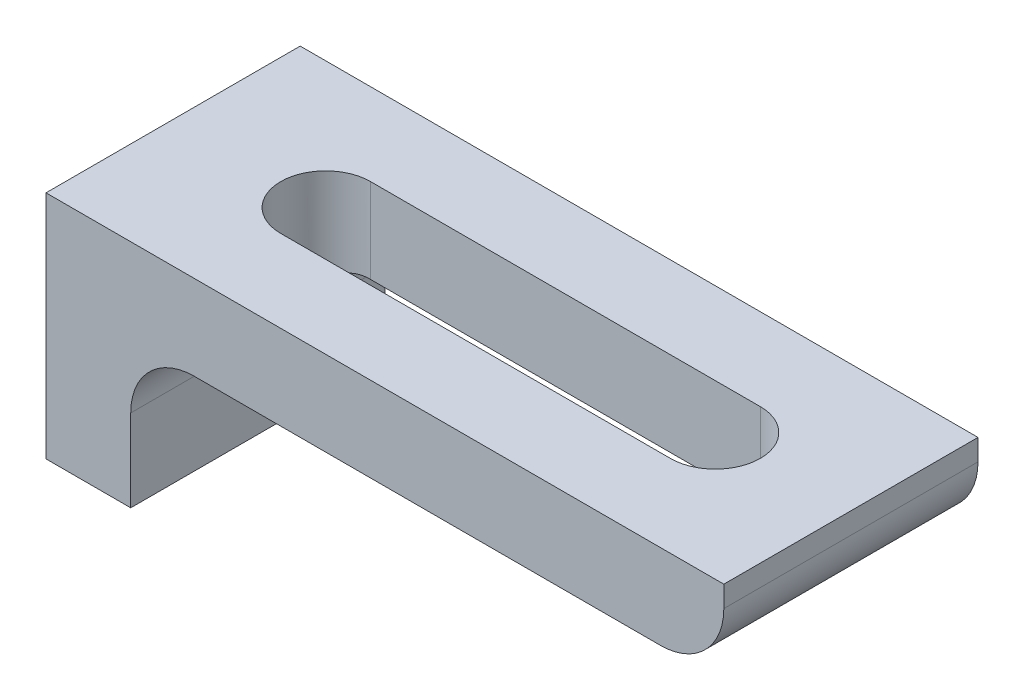
ISO-10303-21;
HEADER;
FILE_DESCRIPTION(('STEP AP214'),'2;1');
FILE_NAME('part.step','',(''),(''),'','','');
FILE_SCHEMA(('AUTOMOTIVE_DESIGN { 1 0 10303 214 1 1 1 1 }'));
ENDSEC;
DATA;
#1=APPLICATION_CONTEXT('core data for automotive mechanical design processes');
#2=APPLICATION_PROTOCOL_DEFINITION('international standard','automotive_design',2000,#1);
#3=PRODUCT_CONTEXT('',#1,'mechanical');
#4=PRODUCT('Part','Part','',(#3));
#5=PRODUCT_RELATED_PRODUCT_CATEGORY('part','',(#4));
#6=PRODUCT_DEFINITION_FORMATION('','',#4);
#7=PRODUCT_DEFINITION_CONTEXT('part definition',#1,'design');
#8=PRODUCT_DEFINITION('design','',#6,#7);
#9=PRODUCT_DEFINITION_SHAPE('','',#8);
#10=(LENGTH_UNIT() NAMED_UNIT(*) SI_UNIT(.MILLI.,.METRE.));
#11=(NAMED_UNIT(*) PLANE_ANGLE_UNIT() SI_UNIT($,.RADIAN.));
#12=(NAMED_UNIT(*) SI_UNIT($,.STERADIAN.) SOLID_ANGLE_UNIT());
#13=UNCERTAINTY_MEASURE_WITH_UNIT(LENGTH_MEASURE(1.E-05),#10,'distance_accuracy_value','');
#14=(GEOMETRIC_REPRESENTATION_CONTEXT(3) GLOBAL_UNCERTAINTY_ASSIGNED_CONTEXT((#13)) GLOBAL_UNIT_ASSIGNED_CONTEXT((#10,
#11,#12)) REPRESENTATION_CONTEXT('',''));
#15=CARTESIAN_POINT('',(0.,0.,0.));
#16=DIRECTION('',(0.,0.,1.));
#17=DIRECTION('',(1.,0.,0.));
#18=AXIS2_PLACEMENT_3D('',#15,#16,#17);
#19=CARTESIAN_POINT('',(-24.0344596091499,6.82331190254084,10.0359364843179));
#20=DIRECTION('',(0.,-1.,0.));
#21=DIRECTION('',(0.,0.,-1.));
#22=AXIS2_PLACEMENT_3D('',#19,#20,#21);
#23=PLANE('',#22);
#24=DIRECTION('',(-1.,0.,0.));
#25=VECTOR('',#24,1.);
#26=CARTESIAN_POINT('',(-12.6044596091499,6.82331190254084,-2.85456351568212));
#27=LINE('',#26,#25);
#28=CARTESIAN_POINT('',(16.6055403908501,6.82331190254084,-2.85456351568212));
#29=VERTEX_POINT('',#28);
#30=CARTESIAN_POINT('',(-12.6044596091499,6.82331190254084,-2.85456351568212));
#31=VERTEX_POINT('',#30);
#32=EDGE_CURVE('E123',#29,#31,#27,.T.);
#33=ORIENTED_EDGE('',*,*,#32,.F.);
#34=CARTESIAN_POINT('',(16.6055403908501,6.82331190254084,0.510936484317881));
#35=DIRECTION('',(0.,1.,0.));
#36=DIRECTION('',(0.,0.,1.));
#37=AXIS2_PLACEMENT_3D('',#34,#35,#36);
#38=CIRCLE('',#37,3.3655);
#39=CARTESIAN_POINT('',(16.6055403908501,6.82331190254084,3.87643648431788));
#40=VERTEX_POINT('',#39);
#41=EDGE_CURVE('E32',#40,#29,#38,.T.);
#42=ORIENTED_EDGE('',*,*,#41,.F.);
#43=DIRECTION('',(1.,0.,0.));
#44=VECTOR('',#43,1.);
#45=CARTESIAN_POINT('',(-12.6044596091499,6.82331190254084,3.87643648431788));
#46=LINE('',#45,#44);
#47=CARTESIAN_POINT('',(-12.6044596091499,6.82331190254084,3.87643648431788));
#48=VERTEX_POINT('',#47);
#49=EDGE_CURVE('E129',#48,#40,#46,.T.);
#50=ORIENTED_EDGE('',*,*,#49,.F.);
#51=CARTESIAN_POINT('',(-12.6044596091499,6.82331190254084,0.510936484317881));
#52=DIRECTION('',(0.,1.,0.));
#53=DIRECTION('',(0.,0.,1.));
#54=AXIS2_PLACEMENT_3D('',#51,#52,#53);
#55=CIRCLE('',#54,3.3655);
#56=EDGE_CURVE('E115',#31,#48,#55,.T.);
#57=ORIENTED_EDGE('',*,*,#56,.F.);
#58=EDGE_LOOP('',(#33,#42,#50,#57));
#59=FACE_BOUND('',#58,.T.);
#60=DIRECTION('',(-1.,0.,0.));
#61=VECTOR('',#60,1.);
#62=CARTESIAN_POINT('',(-24.0344596091499,6.82331190254084,-9.01406351568212));
#63=LINE('',#62,#61);
#64=CARTESIAN_POINT('',(26.7655403908501,6.82331190254084,-9.01406351568212));
#65=VERTEX_POINT('',#64);
#66=CARTESIAN_POINT('',(-24.0344596091499,6.82331190254084,-9.01406351568212));
#67=VERTEX_POINT('',#66);
#68=EDGE_CURVE('E147',#65,#67,#63,.T.);
#69=ORIENTED_EDGE('',*,*,#68,.T.);
#70=DIRECTION('',(0.,0.,-1.));
#71=VECTOR('',#70,1.);
#72=CARTESIAN_POINT('',(-24.0344596091499,6.82331190254084,10.0359364843179));
#73=LINE('',#72,#71);
#74=CARTESIAN_POINT('',(-24.0344596091499,6.82331190254084,10.0359364843179));
#75=VERTEX_POINT('',#74);
#76=EDGE_CURVE('E254',#75,#67,#73,.T.);
#77=ORIENTED_EDGE('',*,*,#76,.F.);
#78=DIRECTION('',(-1.,0.,0.));
#79=VECTOR('',#78,1.);
#80=CARTESIAN_POINT('',(-24.0344596091499,6.82331190254084,10.0359364843179));
#81=LINE('',#80,#79);
#82=CARTESIAN_POINT('',(26.7655403908501,6.82331190254084,10.0359364843179));
#83=VERTEX_POINT('',#82);
#84=EDGE_CURVE('E148',#83,#75,#81,.T.);
#85=ORIENTED_EDGE('',*,*,#84,.F.);
#86=DIRECTION('',(0.,0.,-1.));
#87=VECTOR('',#86,1.);
#88=CARTESIAN_POINT('',(26.7655403908501,6.82331190254084,10.0359364843179));
#89=LINE('',#88,#87);
#90=EDGE_CURVE('E238',#83,#65,#89,.T.);
#91=ORIENTED_EDGE('',*,*,#90,.T.);
#92=EDGE_LOOP('',(#69,#77,#85,#91));
#93=FACE_BOUND('',#92,.T.);
#94=ADVANCED_FACE('F16',(#59,#93),#23,.F.);
#95=CARTESIAN_POINT('',(-24.0344596091499,6.82331190254084,10.0359364843179));
#96=DIRECTION('',(1.,0.,0.));
#97=DIRECTION('',(0.,1.,0.));
#98=AXIS2_PLACEMENT_3D('',#95,#96,#97);
#99=PLANE('',#98);
#100=DIRECTION('',(0.,-1.,0.));
#101=VECTOR('',#100,1.);
#102=CARTESIAN_POINT('',(-24.0344596091499,6.82331190254084,-9.01406351568212));
#103=LINE('',#102,#101);
#104=CARTESIAN_POINT('',(-24.0344596091499,-10.4486880974592,-9.01406351568212));
#105=VERTEX_POINT('',#104);
#106=EDGE_CURVE('E277',#67,#105,#103,.T.);
#107=ORIENTED_EDGE('',*,*,#106,.T.);
#108=DIRECTION('',(0.,0.,-1.));
#109=VECTOR('',#108,1.);
#110=CARTESIAN_POINT('',(-24.0344596091499,-10.4486880974592,10.0359364843179));
#111=LINE('',#110,#109);
#112=CARTESIAN_POINT('',(-24.0344596091499,-10.4486880974592,10.0359364843179));
#113=VERTEX_POINT('',#112);
#114=EDGE_CURVE('E251',#113,#105,#111,.T.);
#115=ORIENTED_EDGE('',*,*,#114,.F.);
#116=DIRECTION('',(0.,-1.,0.));
#117=VECTOR('',#116,1.);
#118=CARTESIAN_POINT('',(-24.0344596091499,6.82331190254084,10.0359364843179));
#119=LINE('',#118,#117);
#120=EDGE_CURVE('E282',#75,#113,#119,.T.);
#121=ORIENTED_EDGE('',*,*,#120,.F.);
#122=ORIENTED_EDGE('',*,*,#76,.T.);
#123=EDGE_LOOP('',(#107,#115,#121,#122));
#124=FACE_BOUND('',#123,.T.);
#125=ADVANCED_FACE('F190',(#124),#99,.F.);
#126=CARTESIAN_POINT('',(-24.0344596091499,-10.4486880974592,10.0359364843179));
#127=DIRECTION('',(0.,1.,0.));
#128=DIRECTION('',(-1.,0.,0.));
#129=AXIS2_PLACEMENT_3D('',#126,#127,#128);
#130=PLANE('',#129);
#131=DIRECTION('',(1.,0.,0.));
#132=VECTOR('',#131,1.);
#133=CARTESIAN_POINT('',(-24.0344596091499,-10.4486880974592,-9.01406351568212));
#134=LINE('',#133,#132);
#135=CARTESIAN_POINT('',(-17.6844596091499,-10.4486880974592,-9.01406351568212));
#136=VERTEX_POINT('',#135);
#137=EDGE_CURVE('E218',#105,#136,#134,.T.);
#138=ORIENTED_EDGE('',*,*,#137,.T.);
#139=DIRECTION('',(0.,0.,-1.));
#140=VECTOR('',#139,1.);
#141=CARTESIAN_POINT('',(-17.6844596091499,-10.4486880974592,10.0359364843179));
#142=LINE('',#141,#140);
#143=CARTESIAN_POINT('',(-17.6844596091499,-10.4486880974592,10.0359364843179));
#144=VERTEX_POINT('',#143);
#145=EDGE_CURVE('E214',#144,#136,#142,.T.);
#146=ORIENTED_EDGE('',*,*,#145,.F.);
#147=DIRECTION('',(1.,0.,0.));
#148=VECTOR('',#147,1.);
#149=CARTESIAN_POINT('',(-24.0344596091499,-10.4486880974592,10.0359364843179));
#150=LINE('',#149,#148);
#151=EDGE_CURVE('E288',#113,#144,#150,.T.);
#152=ORIENTED_EDGE('',*,*,#151,.F.);
#153=ORIENTED_EDGE('',*,*,#114,.T.);
#154=EDGE_LOOP('',(#138,#146,#152,#153));
#155=FACE_BOUND('',#154,.T.);
#156=ADVANCED_FACE('F194',(#155),#130,.F.);
#157=CARTESIAN_POINT('',(-17.6844596091499,-4.28918809745916,10.0359364843179));
#158=DIRECTION('',(-1.,0.,0.));
#159=DIRECTION('',(0.,0.,1.));
#160=AXIS2_PLACEMENT_3D('',#157,#158,#159);
#161=PLANE('',#160);
#162=DIRECTION('',(0.,1.,0.));
#163=VECTOR('',#162,1.);
#164=CARTESIAN_POINT('',(-17.6844596091499,-4.28918809745916,-9.01406351568212));
#165=LINE('',#164,#163);
#166=CARTESIAN_POINT('',(-17.6844596091499,-4.28918809745916,-9.01406351568212));
#167=VERTEX_POINT('',#166);
#168=EDGE_CURVE('E208',#136,#167,#165,.T.);
#169=ORIENTED_EDGE('',*,*,#168,.T.);
#170=DIRECTION('',(0.,0.,-1.));
#171=VECTOR('',#170,1.);
#172=CARTESIAN_POINT('',(-17.6844596091499,-4.28918809745916,10.0359364843179));
#173=LINE('',#172,#171);
#174=CARTESIAN_POINT('',(-17.6844596091499,-4.28918809745916,10.0359364843179));
#175=VERTEX_POINT('',#174);
#176=EDGE_CURVE('E211',#175,#167,#173,.T.);
#177=ORIENTED_EDGE('',*,*,#176,.F.);
#178=DIRECTION('',(0.,1.,0.));
#179=VECTOR('',#178,1.);
#180=CARTESIAN_POINT('',(-17.6844596091499,-4.28918809745916,10.0359364843179));
#181=LINE('',#180,#179);
#182=EDGE_CURVE('E270',#144,#175,#181,.T.);
#183=ORIENTED_EDGE('',*,*,#182,.F.);
#184=ORIENTED_EDGE('',*,*,#145,.T.);
#185=EDGE_LOOP('',(#169,#177,#183,#184));
#186=FACE_BOUND('',#185,.T.);
#187=ADVANCED_FACE('F186',(#186),#161,.F.);
#188=CARTESIAN_POINT('',(-12.9219596091499,-4.28918809745916,10.0359364843179));
#189=DIRECTION('',(0.,0.,-1.));
#190=DIRECTION('',(-1.,0.,0.));
#191=AXIS2_PLACEMENT_3D('',#188,#189,#190);
#192=CYLINDRICAL_SURFACE('',#191,4.7625);
#193=DIRECTION('',(0.,0.,-1.));
#194=VECTOR('',#193,1.);
#195=CARTESIAN_POINT('',(-12.9219596091499,0.47331190254084,10.0359364843179));
#196=LINE('',#195,#194);
#197=CARTESIAN_POINT('',(-12.9219596091499,0.473311902540839,-2.83955362908344));
#198=VERTEX_POINT('',#197);
#199=CARTESIAN_POINT('',(-12.9219596091499,0.47331190254084,-9.01406351568212));
#200=VERTEX_POINT('',#199);
#201=EDGE_CURVE('E248',#198,#200,#196,.T.);
#202=ORIENTED_EDGE('',*,*,#201,.F.);
#203=CARTESIAN_POINT('',(-12.9219596091499,0.473311902540839,-2.83955362908344));
#204=CARTESIAN_POINT('',(-13.0069434278435,0.47333033507111,-2.83151765143906));
#205=CARTESIAN_POINT('',(-13.0915989145957,0.471037797897241,-2.82021657779605));
#206=CARTESIAN_POINT('',(-13.2595262051785,0.462072076475994,-2.79129018998337));
#207=CARTESIAN_POINT('',(-13.3427989716688,0.455402083266115,-2.77366948687915));
#208=CARTESIAN_POINT('',(-13.5068197322449,0.437979409589271,-2.7324332198711));
#209=CARTESIAN_POINT('',(-13.5875807055468,0.427253799272244,-2.70885774156315));
#210=CARTESIAN_POINT('',(-13.7465823380659,0.402068892590364,-2.65595071957358));
#211=CARTESIAN_POINT('',(-13.824822636555,0.387609064476115,-2.6266183562594));
#212=CARTESIAN_POINT('',(-14.0546142908027,0.339298105803369,-2.53062492244202));
#213=CARTESIAN_POINT('',(-14.2018124906423,0.30044976864853,-2.45582017138706));
#214=CARTESIAN_POINT('',(-14.481735688424,0.213045825864727,-2.28714119055662));
#215=CARTESIAN_POINT('',(-14.6144386494993,0.164475749398812,-2.19323853009456));
#216=CARTESIAN_POINT('',(-14.8758303991107,0.0565756518245694,-1.97879364588288));
#217=CARTESIAN_POINT('',(-15.0028768323697,-0.00334128365014221,-1.85654967827265));
#218=CARTESIAN_POINT('',(-15.2363251339402,-0.124761863746644,-1.59400583872912));
#219=CARTESIAN_POINT('',(-15.3426959875889,-0.186267737681622,-1.45367935828283));
#220=CARTESIAN_POINT('',(-15.491749744689,-0.278996105264789,-1.22115351273748));
#221=CARTESIAN_POINT('',(-15.5420759590164,-0.311807547187342,-1.13439947855961));
#222=CARTESIAN_POINT('',(-15.635148432742,-0.374706958163021,-0.955912373197777));
#223=CARTESIAN_POINT('',(-15.6778931750521,-0.404794381538884,-0.864178310272388));
#224=CARTESIAN_POINT('',(-15.7552043360552,-0.46081894951436,-0.676362753662811));
#225=CARTESIAN_POINT('',(-15.7897902425677,-0.486765934760661,-0.580292285904265));
#226=CARTESIAN_POINT('',(-15.8503426140878,-0.533202195645669,-0.384251653120059));
#227=CARTESIAN_POINT('',(-15.876313862092,-0.553694498558842,-0.284283686622023));
#228=CARTESIAN_POINT('',(-15.9279405472527,-0.594998871274651,-0.0391040150866571));
#229=CARTESIAN_POINT('',(-15.9490159299295,-0.612432596933294,0.107708029447119));
#230=CARTESIAN_POINT('',(-15.9715206774517,-0.631071679058516,0.403720960079187));
#231=CARTESIAN_POINT('',(-15.9729706817383,-0.632294084472941,0.552919171305543));
#232=CARTESIAN_POINT('',(-15.9561959973906,-0.618368389824922,0.849262977360477));
#233=CARTESIAN_POINT('',(-15.9379889214283,-0.603234944532118,0.996410290221539));
#234=CARTESIAN_POINT('',(-15.8830205075052,-0.55894158171338,1.28507540129367));
#235=CARTESIAN_POINT('',(-15.8462337606802,-0.529762458414369,1.42658520316277));
#236=CARTESIAN_POINT('',(-15.7422778896953,-0.450880411397123,1.74214747211029));
#237=CARTESIAN_POINT('',(-15.6693340909616,-0.397657268467484,1.91340656284502));
#238=CARTESIAN_POINT('',(-15.4980529286024,-0.28221808621602,2.23944432908974));
#239=CARTESIAN_POINT('',(-15.3996766161065,-0.219988318524459,2.39419720794293));
#240=CARTESIAN_POINT('',(-15.1780658134417,-0.0930054560301221,2.68749161214477));
#241=CARTESIAN_POINT('',(-15.0544946266513,-0.0282289579797821,2.82576841280556));
#242=CARTESIAN_POINT('',(-14.7850293616258,0.0962836786078873,3.08116960662859));
#243=CARTESIAN_POINT('',(-14.639153148722,0.156023792177113,3.19831076623599));
#244=CARTESIAN_POINT('',(-14.3442626861621,0.258347745421761,3.39670899586663));
#245=CARTESIAN_POINT('',(-14.1973615367592,0.302096239935744,3.48049671447018));
#246=CARTESIAN_POINT('',(-13.8900353011453,0.376548340677496,3.62584238169864));
#247=CARTESIAN_POINT('',(-13.7296393372336,0.407279215717884,3.68744675812214));
#248=CARTESIAN_POINT('',(-13.4604192730736,0.443942032426791,3.76758124094424));
#249=CARTESIAN_POINT('',(-13.3544483391451,0.454841799212284,3.79361605933183));
#250=CARTESIAN_POINT('',(-13.1398439924586,0.469552136583295,3.83538769083381));
#251=CARTESIAN_POINT('',(-13.0312065647683,0.473351256013865,3.85110784312861));
#252=CARTESIAN_POINT('',(-12.9219596091499,0.47331190254084,3.8614265977192));
#253=B_SPLINE_CURVE_WITH_KNOTS('',3,(#203,#204,#205,#206,#207,#208,#209,#210,#211,#212,#213,
#214,#215,#216,#217,#218,#219,#220,#221,#222,#223,#224,#225,#226,#227,#228,#229,#230,#231,#232,
#233,#234,#235,#236,#237,#238,#239,#240,#241,#242,#243,#244,#245,#246,#247,#248,#249,#250,#251,
#252),.UNSPECIFIED.,.F.,.F.,(4,2,2,2,2,2,2,2,2,2,2,2,2,2,2,2,2,2,2,2,2,2,2,2,4),(0.,
0.255965739163783,0.511745093731985,0.765846493553393,1.01998409716625,1.52648736278331,
2.03375024297806,2.59029220732077,3.14766268337644,3.46388399688055,3.78016851654173,
4.09568974609413,4.41103549882015,4.85690462948991,5.30230481605256,5.74730625661964,
6.19291791905798,6.77066932446045,7.34931082911733,7.93626213344526,8.52274575504494,
9.04466934880573,9.56549416461412,9.89379592271876,10.2226266750213),.UNSPECIFIED.);
#254=CARTESIAN_POINT('',(-12.9219596091499,0.473311902540843,3.8614265977192));
#255=VERTEX_POINT('',#254);
#256=EDGE_CURVE('E136',#198,#255,#253,.T.);
#257=ORIENTED_EDGE('',*,*,#256,.T.);
#258=CARTESIAN_POINT('',(-12.9219596091499,0.47331190254084,10.0359364843179));
#259=VERTEX_POINT('',#258);
#260=EDGE_CURVE('E225',#259,#255,#196,.T.);
#261=ORIENTED_EDGE('',*,*,#260,.F.);
#262=CARTESIAN_POINT('',(-12.9219596091499,-4.28918809745916,10.0359364843179));
#263=DIRECTION('',(0.,0.,-1.));
#264=DIRECTION('',(-1.,0.,0.));
#265=AXIS2_PLACEMENT_3D('',#262,#263,#264);
#266=CIRCLE('',#265,4.7625);
#267=EDGE_CURVE('E224',#175,#259,#266,.T.);
#268=ORIENTED_EDGE('',*,*,#267,.F.);
#269=ORIENTED_EDGE('',*,*,#176,.T.);
#270=CARTESIAN_POINT('',(-12.9219596091499,-4.28918809745916,-9.01406351568212));
#271=DIRECTION('',(0.,0.,-1.));
#272=DIRECTION('',(-1.,0.,0.));
#273=AXIS2_PLACEMENT_3D('',#270,#271,#272);
#274=CIRCLE('',#273,4.7625);
#275=EDGE_CURVE('E217',#167,#200,#274,.T.);
#276=ORIENTED_EDGE('',*,*,#275,.T.);
#277=EDGE_LOOP('',(#202,#257,#261,#268,#269,#276));
#278=FACE_BOUND('',#277,.T.);
#279=ADVANCED_FACE('F150',(#278),#192,.F.);
#280=CARTESIAN_POINT('',(-12.9219596091499,0.473311902540843,10.0359364843179));
#281=DIRECTION('',(0.,1.,0.));
#282=DIRECTION('',(0.,0.,1.));
#283=AXIS2_PLACEMENT_3D('',#280,#281,#282);
#284=PLANE('',#283);
#285=ORIENTED_EDGE('',*,*,#260,.T.);
#286=CARTESIAN_POINT('',(-12.6044596091499,0.473311902540843,0.510936484317881));
#287=DIRECTION('',(0.,1.,0.));
#288=DIRECTION('',(0.,0.,1.));
#289=AXIS2_PLACEMENT_3D('',#286,#287,#288);
#290=CIRCLE('',#289,3.3655);
#291=CARTESIAN_POINT('',(-12.6044596091499,0.473311902540843,3.87643648431788));
#292=VERTEX_POINT('',#291);
#293=EDGE_CURVE('E11',#255,#292,#290,.T.);
#294=ORIENTED_EDGE('',*,*,#293,.T.);
#295=DIRECTION('',(1.,0.,0.));
#296=VECTOR('',#295,1.);
#297=CARTESIAN_POINT('',(-12.9219596091499,0.473311902540843,3.87643648431788));
#298=LINE('',#297,#296);
#299=CARTESIAN_POINT('',(16.6055403908501,0.473311902540843,3.87643648431788));
#300=VERTEX_POINT('',#299);
#301=EDGE_CURVE('E19',#292,#300,#298,.T.);
#302=ORIENTED_EDGE('',*,*,#301,.T.);
#303=CARTESIAN_POINT('',(16.6055403908501,0.473311902540843,0.510936484317881));
#304=DIRECTION('',(0.,1.,0.));
#305=DIRECTION('',(0.,0.,1.));
#306=AXIS2_PLACEMENT_3D('',#303,#304,#305);
#307=CIRCLE('',#306,3.3655);
#308=CARTESIAN_POINT('',(16.6055403908501,0.473311902540843,-2.85456351568212));
#309=VERTEX_POINT('',#308);
#310=EDGE_CURVE('E258',#300,#309,#307,.T.);
#311=ORIENTED_EDGE('',*,*,#310,.T.);
#312=DIRECTION('',(-1.,0.,0.));
#313=VECTOR('',#312,1.);
#314=CARTESIAN_POINT('',(-12.9219596091499,0.473311902540843,-2.85456351568212));
#315=LINE('',#314,#313);
#316=CARTESIAN_POINT('',(-12.6044596091499,0.473311902540843,-2.85456351568212));
#317=VERTEX_POINT('',#316);
#318=EDGE_CURVE('E257',#309,#317,#315,.T.);
#319=ORIENTED_EDGE('',*,*,#318,.T.);
#320=EDGE_CURVE('E25',#317,#198,#290,.T.);
#321=ORIENTED_EDGE('',*,*,#320,.T.);
#322=ORIENTED_EDGE('',*,*,#201,.T.);
#323=DIRECTION('',(1.,0.,0.));
#324=VECTOR('',#323,1.);
#325=CARTESIAN_POINT('',(-12.9219596091499,0.473311902540843,-9.01406351568212));
#326=LINE('',#325,#324);
#327=CARTESIAN_POINT('',(22.0030403908501,0.473311902540843,-9.01406351568212));
#328=VERTEX_POINT('',#327);
#329=EDGE_CURVE('E229',#200,#328,#326,.T.);
#330=ORIENTED_EDGE('',*,*,#329,.T.);
#331=DIRECTION('',(0.,0.,-1.));
#332=VECTOR('',#331,1.);
#333=CARTESIAN_POINT('',(22.0030403908501,0.473311902540843,10.0359364843179));
#334=LINE('',#333,#332);
#335=CARTESIAN_POINT('',(22.0030403908501,0.473311902540843,10.0359364843179));
#336=VERTEX_POINT('',#335);
#337=EDGE_CURVE('E245',#336,#328,#334,.T.);
#338=ORIENTED_EDGE('',*,*,#337,.F.);
#339=DIRECTION('',(1.,0.,0.));
#340=VECTOR('',#339,1.);
#341=CARTESIAN_POINT('',(-12.9219596091499,0.473311902540843,10.0359364843179));
#342=LINE('',#341,#340);
#343=EDGE_CURVE('E265',#259,#336,#342,.T.);
#344=ORIENTED_EDGE('',*,*,#343,.F.);
#345=EDGE_LOOP('',(#285,#294,#302,#311,#319,#321,#322,#330,#338,#344));
#346=FACE_BOUND('',#345,.T.);
#347=ADVANCED_FACE('F178',(#346),#284,.F.);
#348=CARTESIAN_POINT('',(22.0030403908501,5.23581190254084,10.0359364843179));
#349=DIRECTION('',(0.,0.,-1.));
#350=DIRECTION('',(-1.,0.,0.));
#351=AXIS2_PLACEMENT_3D('',#348,#349,#350);
#352=CYLINDRICAL_SURFACE('',#351,4.7625);
#353=CARTESIAN_POINT('',(22.0030403908501,5.23581190254084,-9.01406351568212));
#354=DIRECTION('',(0.,0.,1.));
#355=DIRECTION('',(1.,0.,0.));
#356=AXIS2_PLACEMENT_3D('',#353,#354,#355);
#357=CIRCLE('',#356,4.7625);
#358=CARTESIAN_POINT('',(26.7655403908501,5.23581190254084,-9.01406351568212));
#359=VERTEX_POINT('',#358);
#360=EDGE_CURVE('E231',#328,#359,#357,.T.);
#361=ORIENTED_EDGE('',*,*,#360,.T.);
#362=DIRECTION('',(0.,0.,-1.));
#363=VECTOR('',#362,1.);
#364=CARTESIAN_POINT('',(26.7655403908501,5.23581190254084,10.0359364843179));
#365=LINE('',#364,#363);
#366=CARTESIAN_POINT('',(26.7655403908501,5.23581190254084,10.0359364843179));
#367=VERTEX_POINT('',#366);
#368=EDGE_CURVE('E241',#367,#359,#365,.T.);
#369=ORIENTED_EDGE('',*,*,#368,.F.);
#370=CARTESIAN_POINT('',(22.0030403908501,5.23581190254084,10.0359364843179));
#371=DIRECTION('',(0.,0.,1.));
#372=DIRECTION('',(1.,0.,0.));
#373=AXIS2_PLACEMENT_3D('',#370,#371,#372);
#374=CIRCLE('',#373,4.7625);
#375=EDGE_CURVE('E267',#336,#367,#374,.T.);
#376=ORIENTED_EDGE('',*,*,#375,.F.);
#377=ORIENTED_EDGE('',*,*,#337,.T.);
#378=EDGE_LOOP('',(#361,#369,#376,#377));
#379=FACE_BOUND('',#378,.T.);
#380=ADVANCED_FACE('F175',(#379),#352,.T.);
#381=CARTESIAN_POINT('',(26.7655403908501,6.82331190254084,10.0359364843179));
#382=DIRECTION('',(-1.,0.,0.));
#383=DIRECTION('',(0.,-1.,0.));
#384=AXIS2_PLACEMENT_3D('',#381,#382,#383);
#385=PLANE('',#384);
#386=DIRECTION('',(0.,1.,0.));
#387=VECTOR('',#386,1.);
#388=CARTESIAN_POINT('',(26.7655403908501,6.82331190254084,-9.01406351568212));
#389=LINE('',#388,#387);
#390=EDGE_CURVE('E236',#359,#65,#389,.T.);
#391=ORIENTED_EDGE('',*,*,#390,.T.);
#392=ORIENTED_EDGE('',*,*,#90,.F.);
#393=DIRECTION('',(0.,1.,0.));
#394=VECTOR('',#393,1.);
#395=CARTESIAN_POINT('',(26.7655403908501,6.82331190254084,10.0359364843179));
#396=LINE('',#395,#394);
#397=EDGE_CURVE('E242',#367,#83,#396,.T.);
#398=ORIENTED_EDGE('',*,*,#397,.F.);
#399=ORIENTED_EDGE('',*,*,#368,.T.);
#400=EDGE_LOOP('',(#391,#392,#398,#399));
#401=FACE_BOUND('',#400,.T.);
#402=ADVANCED_FACE('F168',(#401),#385,.F.);
#403=CARTESIAN_POINT('',(22.0030403908501,5.23581190254084,10.0359364843179));
#404=DIRECTION('',(0.,0.,1.));
#405=DIRECTION('',(1.,0.,0.));
#406=AXIS2_PLACEMENT_3D('',#403,#404,#405);
#407=PLANE('',#406);
#408=ORIENTED_EDGE('',*,*,#84,.T.);
#409=ORIENTED_EDGE('',*,*,#120,.T.);
#410=ORIENTED_EDGE('',*,*,#151,.T.);
#411=ORIENTED_EDGE('',*,*,#182,.T.);
#412=ORIENTED_EDGE('',*,*,#267,.T.);
#413=ORIENTED_EDGE('',*,*,#343,.T.);
#414=ORIENTED_EDGE('',*,*,#375,.T.);
#415=ORIENTED_EDGE('',*,*,#397,.T.);
#416=EDGE_LOOP('',(#408,#409,#410,#411,#412,#413,#414,#415));
#417=FACE_BOUND('',#416,.T.);
#418=ADVANCED_FACE('F165',(#417),#407,.T.);
#419=CARTESIAN_POINT('',(22.0030403908501,5.23581190254084,-9.01406351568212));
#420=DIRECTION('',(0.,0.,1.));
#421=DIRECTION('',(1.,0.,0.));
#422=AXIS2_PLACEMENT_3D('',#419,#420,#421);
#423=PLANE('',#422);
#424=ORIENTED_EDGE('',*,*,#68,.F.);
#425=ORIENTED_EDGE('',*,*,#390,.F.);
#426=ORIENTED_EDGE('',*,*,#360,.F.);
#427=ORIENTED_EDGE('',*,*,#329,.F.);
#428=ORIENTED_EDGE('',*,*,#275,.F.);
#429=ORIENTED_EDGE('',*,*,#168,.F.);
#430=ORIENTED_EDGE('',*,*,#137,.F.);
#431=ORIENTED_EDGE('',*,*,#106,.F.);
#432=EDGE_LOOP('',(#424,#425,#426,#427,#428,#429,#430,#431));
#433=FACE_BOUND('',#432,.T.);
#434=ADVANCED_FACE('F164',(#433),#423,.F.);
#435=CARTESIAN_POINT('',(16.6055403908501,-10.4486880974592,0.510936484317881));
#436=DIRECTION('',(0.,1.,0.));
#437=DIRECTION('',(0.,0.,1.));
#438=AXIS2_PLACEMENT_3D('',#435,#436,#437);
#439=CYLINDRICAL_SURFACE('',#438,3.3655);
#440=DIRECTION('',(0.,1.,0.));
#441=VECTOR('',#440,1.);
#442=CARTESIAN_POINT('',(16.6055403908501,-10.4486880974592,3.87643648431788));
#443=LINE('',#442,#441);
#444=EDGE_CURVE('E134',#300,#40,#443,.T.);
#445=ORIENTED_EDGE('',*,*,#444,.T.);
#446=ORIENTED_EDGE('',*,*,#41,.T.);
#447=DIRECTION('',(0.,1.,0.));
#448=VECTOR('',#447,1.);
#449=CARTESIAN_POINT('',(16.6055403908501,-10.4486880974592,-2.85456351568212));
#450=LINE('',#449,#448);
#451=EDGE_CURVE('E120',#309,#29,#450,.T.);
#452=ORIENTED_EDGE('',*,*,#451,.F.);
#453=ORIENTED_EDGE('',*,*,#310,.F.);
#454=EDGE_LOOP('',(#445,#446,#452,#453));
#455=FACE_BOUND('',#454,.T.);
#456=ADVANCED_FACE('F161',(#455),#439,.F.);
#457=CARTESIAN_POINT('',(-12.6044596091499,-10.4486880974592,3.87643648431788));
#458=DIRECTION('',(0.,0.,1.));
#459=DIRECTION('',(1.,0.,0.));
#460=AXIS2_PLACEMENT_3D('',#457,#458,#459);
#461=PLANE('',#460);
#462=DIRECTION('',(0.,1.,0.));
#463=VECTOR('',#462,1.);
#464=CARTESIAN_POINT('',(-12.6044596091499,-10.4486880974592,3.87643648431788));
#465=LINE('',#464,#463);
#466=EDGE_CURVE('E119',#292,#48,#465,.T.);
#467=ORIENTED_EDGE('',*,*,#466,.T.);
#468=ORIENTED_EDGE('',*,*,#49,.T.);
#469=ORIENTED_EDGE('',*,*,#444,.F.);
#470=ORIENTED_EDGE('',*,*,#301,.F.);
#471=EDGE_LOOP('',(#467,#468,#469,#470));
#472=FACE_BOUND('',#471,.T.);
#473=ADVANCED_FACE('F158',(#472),#461,.F.);
#474=CARTESIAN_POINT('',(-12.6044596091499,-10.4486880974592,0.510936484317881));
#475=DIRECTION('',(0.,1.,0.));
#476=DIRECTION('',(0.,0.,1.));
#477=AXIS2_PLACEMENT_3D('',#474,#475,#476);
#478=CYLINDRICAL_SURFACE('',#477,3.3655);
#479=DIRECTION('',(0.,1.,0.));
#480=VECTOR('',#479,1.);
#481=CARTESIAN_POINT('',(-12.6044596091499,-10.4486880974592,-2.85456351568212));
#482=LINE('',#481,#480);
#483=EDGE_CURVE('E40',#317,#31,#482,.T.);
#484=ORIENTED_EDGE('',*,*,#483,.T.);
#485=ORIENTED_EDGE('',*,*,#56,.T.);
#486=ORIENTED_EDGE('',*,*,#466,.F.);
#487=ORIENTED_EDGE('',*,*,#293,.F.);
#488=ORIENTED_EDGE('',*,*,#256,.F.);
#489=ORIENTED_EDGE('',*,*,#320,.F.);
#490=EDGE_LOOP('',(#484,#485,#486,#487,#488,#489));
#491=FACE_BOUND('',#490,.T.);
#492=ADVANCED_FACE('F112',(#491),#478,.F.);
#493=CARTESIAN_POINT('',(-12.6044596091499,-10.4486880974592,-2.85456351568212));
#494=DIRECTION('',(0.,0.,-1.));
#495=DIRECTION('',(-1.,0.,0.));
#496=AXIS2_PLACEMENT_3D('',#493,#494,#495);
#497=PLANE('',#496);
#498=ORIENTED_EDGE('',*,*,#451,.T.);
#499=ORIENTED_EDGE('',*,*,#32,.T.);
#500=ORIENTED_EDGE('',*,*,#483,.F.);
#501=ORIENTED_EDGE('',*,*,#318,.F.);
#502=EDGE_LOOP('',(#498,#499,#500,#501));
#503=FACE_BOUND('',#502,.T.);
#504=ADVANCED_FACE('F124',(#503),#497,.F.);
#505=CLOSED_SHELL('',(#94,#125,#156,#187,#279,#347,#380,#402,#418,#434,#456,#473,#492,#504));
#506=MANIFOLD_SOLID_BREP('B1',#505);
#507=ADVANCED_BREP_SHAPE_REPRESENTATION('',(#18,#506),#14);
#508=SHAPE_DEFINITION_REPRESENTATION(#9,#507);
ENDSEC;
END-ISO-10303-21;
